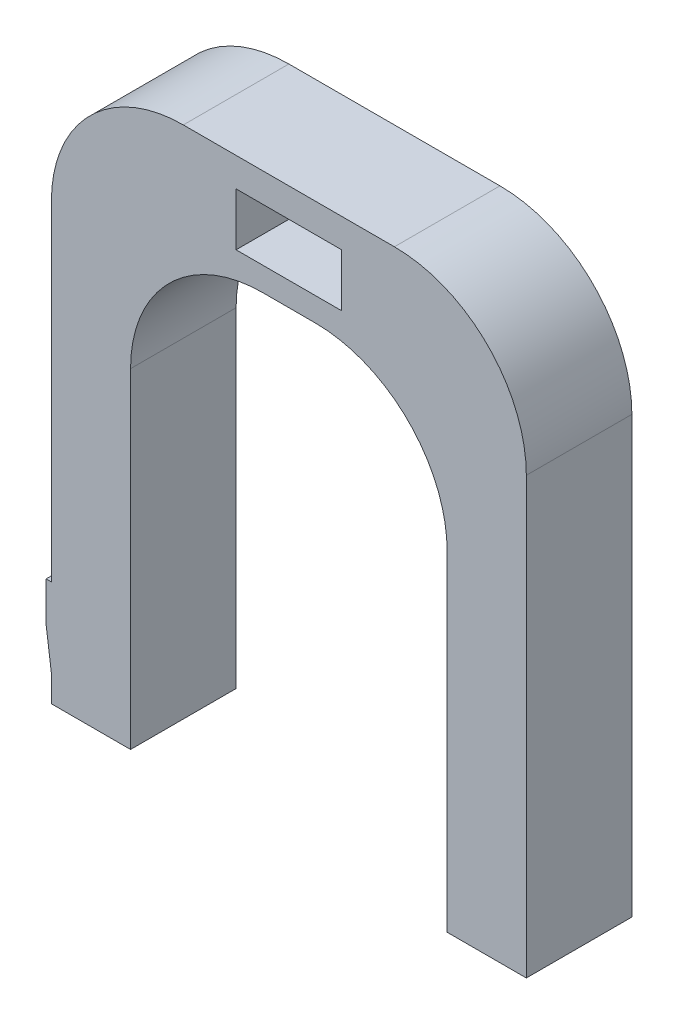
ISO-10303-21;
HEADER;
FILE_DESCRIPTION(('STEP AP214'),'2;1');
FILE_NAME('part.step','',(''),(''),'','','');
FILE_SCHEMA(('AUTOMOTIVE_DESIGN { 1 0 10303 214 1 1 1 1 }'));
ENDSEC;
DATA;
#1=APPLICATION_CONTEXT('core data for automotive mechanical design processes');
#2=APPLICATION_PROTOCOL_DEFINITION('international standard','automotive_design',2000,#1);
#3=PRODUCT_CONTEXT('',#1,'mechanical');
#4=PRODUCT('Part','Part','',(#3));
#5=PRODUCT_RELATED_PRODUCT_CATEGORY('part','',(#4));
#6=PRODUCT_DEFINITION_FORMATION('','',#4);
#7=PRODUCT_DEFINITION_CONTEXT('part definition',#1,'design');
#8=PRODUCT_DEFINITION('design','',#6,#7);
#9=PRODUCT_DEFINITION_SHAPE('','',#8);
#10=(LENGTH_UNIT() NAMED_UNIT(*) SI_UNIT(.MILLI.,.METRE.));
#11=(NAMED_UNIT(*) PLANE_ANGLE_UNIT() SI_UNIT($,.RADIAN.));
#12=(NAMED_UNIT(*) SI_UNIT($,.STERADIAN.) SOLID_ANGLE_UNIT());
#13=UNCERTAINTY_MEASURE_WITH_UNIT(LENGTH_MEASURE(1.E-05),#10,'distance_accuracy_value','');
#14=(GEOMETRIC_REPRESENTATION_CONTEXT(3) GLOBAL_UNCERTAINTY_ASSIGNED_CONTEXT((#13)) GLOBAL_UNIT_ASSIGNED_CONTEXT((#10,
#11,#12)) REPRESENTATION_CONTEXT('',''));
#15=CARTESIAN_POINT('',(0.,0.,0.));
#16=DIRECTION('',(0.,0.,1.));
#17=DIRECTION('',(1.,0.,0.));
#18=AXIS2_PLACEMENT_3D('',#15,#16,#17);
#19=CARTESIAN_POINT('',(0.,0.,4.));
#20=DIRECTION('',(1.,0.,0.));
#21=DIRECTION('',(0.,0.,-1.));
#22=AXIS2_PLACEMENT_3D('',#19,#20,#21);
#23=PLANE('',#22);
#24=DIRECTION('',(0.,0.,1.));
#25=VECTOR('',#24,1.);
#26=CARTESIAN_POINT('',(0.,1.,0.));
#27=LINE('',#26,#25);
#28=CARTESIAN_POINT('',(0.,1.,0.));
#29=VERTEX_POINT('',#28);
#30=CARTESIAN_POINT('',(0.,1.,4.));
#31=VERTEX_POINT('',#30);
#32=EDGE_CURVE('E173',#29,#31,#27,.T.);
#33=ORIENTED_EDGE('',*,*,#32,.F.);
#34=DIRECTION('',(0.,-1.,0.));
#35=VECTOR('',#34,1.);
#36=CARTESIAN_POINT('',(0.,0.,0.));
#37=LINE('',#36,#35);
#38=CARTESIAN_POINT('',(0.,0.,0.));
#39=VERTEX_POINT('',#38);
#40=EDGE_CURVE('E180',#29,#39,#37,.T.);
#41=ORIENTED_EDGE('',*,*,#40,.T.);
#42=DIRECTION('',(0.,0.,-1.));
#43=VECTOR('',#42,1.);
#44=CARTESIAN_POINT('',(0.,0.,4.));
#45=LINE('',#44,#43);
#46=CARTESIAN_POINT('',(0.,0.,4.));
#47=VERTEX_POINT('',#46);
#48=EDGE_CURVE('E282',#47,#39,#45,.T.);
#49=ORIENTED_EDGE('',*,*,#48,.F.);
#50=DIRECTION('',(0.,-1.,0.));
#51=VECTOR('',#50,1.);
#52=CARTESIAN_POINT('',(0.,0.,4.));
#53=LINE('',#52,#51);
#54=EDGE_CURVE('E192',#31,#47,#53,.T.);
#55=ORIENTED_EDGE('',*,*,#54,.F.);
#56=EDGE_LOOP('',(#33,#41,#49,#55));
#57=FACE_BOUND('',#56,.T.);
#58=ADVANCED_FACE('F33',(#57),#23,.F.);
#59=DIRECTION('',(0.,0.,-1.));
#60=VECTOR('',#59,1.);
#61=CARTESIAN_POINT('',(0.,4.,0.));
#62=LINE('',#61,#60);
#63=CARTESIAN_POINT('',(0.,4.,4.));
#64=VERTEX_POINT('',#63);
#65=CARTESIAN_POINT('',(0.,4.,0.));
#66=VERTEX_POINT('',#65);
#67=EDGE_CURVE('E56',#64,#66,#62,.T.);
#68=ORIENTED_EDGE('',*,*,#67,.F.);
#69=CARTESIAN_POINT('',(0.,16.5,4.));
#70=VERTEX_POINT('',#69);
#71=EDGE_CURVE('E259',#70,#64,#53,.T.);
#72=ORIENTED_EDGE('',*,*,#71,.F.);
#73=DIRECTION('',(0.,0.,-1.));
#74=VECTOR('',#73,1.);
#75=CARTESIAN_POINT('',(0.,16.5,4.));
#76=LINE('',#75,#74);
#77=CARTESIAN_POINT('',(0.,16.5,0.));
#78=VERTEX_POINT('',#77);
#79=EDGE_CURVE('E11',#70,#78,#76,.T.);
#80=ORIENTED_EDGE('',*,*,#79,.T.);
#81=EDGE_CURVE('E188',#78,#66,#37,.T.);
#82=ORIENTED_EDGE('',*,*,#81,.T.);
#83=EDGE_LOOP('',(#68,#72,#80,#82));
#84=FACE_BOUND('',#83,.T.);
#85=ADVANCED_FACE('F373',(#84),#23,.F.);
#86=CARTESIAN_POINT('',(0.,0.,4.));
#87=DIRECTION('',(0.,1.,0.));
#88=DIRECTION('',(0.,0.,1.));
#89=AXIS2_PLACEMENT_3D('',#86,#87,#88);
#90=PLANE('',#89);
#91=DIRECTION('',(1.,0.,0.));
#92=VECTOR('',#91,1.);
#93=CARTESIAN_POINT('',(0.,0.,0.));
#94=LINE('',#93,#92);
#95=CARTESIAN_POINT('',(3.,0.,0.));
#96=VERTEX_POINT('',#95);
#97=EDGE_CURVE('E184',#39,#96,#94,.T.);
#98=ORIENTED_EDGE('',*,*,#97,.T.);
#99=DIRECTION('',(0.,0.,1.));
#100=VECTOR('',#99,1.);
#101=CARTESIAN_POINT('',(3.,0.,0.));
#102=LINE('',#101,#100);
#103=CARTESIAN_POINT('',(3.,0.,4.));
#104=VERTEX_POINT('',#103);
#105=EDGE_CURVE('E249',#96,#104,#102,.T.);
#106=ORIENTED_EDGE('',*,*,#105,.T.);
#107=DIRECTION('',(1.,0.,0.));
#108=VECTOR('',#107,1.);
#109=CARTESIAN_POINT('',(0.,0.,4.));
#110=LINE('',#109,#108);
#111=EDGE_CURVE('E262',#47,#104,#110,.T.);
#112=ORIENTED_EDGE('',*,*,#111,.F.);
#113=ORIENTED_EDGE('',*,*,#48,.T.);
#114=EDGE_LOOP('',(#98,#106,#112,#113));
#115=FACE_BOUND('',#114,.T.);
#116=ADVANCED_FACE('F361',(#115),#90,.F.);
#117=CARTESIAN_POINT('',(15.,0.,4.));
#118=VERTEX_POINT('',#117);
#119=CARTESIAN_POINT('',(18.,0.,4.));
#120=VERTEX_POINT('',#119);
#121=EDGE_CURVE('E261',#118,#120,#110,.T.);
#122=ORIENTED_EDGE('',*,*,#121,.F.);
#123=DIRECTION('',(0.,0.,1.));
#124=VECTOR('',#123,1.);
#125=CARTESIAN_POINT('',(15.,0.,0.));
#126=LINE('',#125,#124);
#127=CARTESIAN_POINT('',(15.,0.,0.));
#128=VERTEX_POINT('',#127);
#129=EDGE_CURVE('E189',#128,#118,#126,.T.);
#130=ORIENTED_EDGE('',*,*,#129,.F.);
#131=CARTESIAN_POINT('',(18.,0.,0.));
#132=VERTEX_POINT('',#131);
#133=EDGE_CURVE('E272',#128,#132,#94,.T.);
#134=ORIENTED_EDGE('',*,*,#133,.T.);
#135=DIRECTION('',(0.,0.,-1.));
#136=VECTOR('',#135,1.);
#137=CARTESIAN_POINT('',(18.,0.,4.));
#138=LINE('',#137,#136);
#139=EDGE_CURVE('E270',#120,#132,#138,.T.);
#140=ORIENTED_EDGE('',*,*,#139,.F.);
#141=EDGE_LOOP('',(#122,#130,#134,#140));
#142=FACE_BOUND('',#141,.T.);
#143=ADVANCED_FACE('F336',(#142),#90,.F.);
#144=CARTESIAN_POINT('',(18.,0.,4.));
#145=DIRECTION('',(-1.,0.,0.));
#146=DIRECTION('',(0.,0.,1.));
#147=AXIS2_PLACEMENT_3D('',#144,#145,#146);
#148=PLANE('',#147);
#149=DIRECTION('',(0.,1.,0.));
#150=VECTOR('',#149,1.);
#151=CARTESIAN_POINT('',(18.,0.,0.));
#152=LINE('',#151,#150);
#153=CARTESIAN_POINT('',(18.,16.5,0.));
#154=VERTEX_POINT('',#153);
#155=EDGE_CURVE('E274',#132,#154,#152,.T.);
#156=ORIENTED_EDGE('',*,*,#155,.T.);
#157=DIRECTION('',(0.,0.,-1.));
#158=VECTOR('',#157,1.);
#159=CARTESIAN_POINT('',(18.,16.5,4.));
#160=LINE('',#159,#158);
#161=CARTESIAN_POINT('',(18.,16.5,4.));
#162=VERTEX_POINT('',#161);
#163=EDGE_CURVE('E311',#154,#162,#160,.F.);
#164=ORIENTED_EDGE('',*,*,#163,.T.);
#165=DIRECTION('',(0.,1.,0.));
#166=VECTOR('',#165,1.);
#167=CARTESIAN_POINT('',(18.,0.,4.));
#168=LINE('',#167,#166);
#169=EDGE_CURVE('E265',#120,#162,#168,.T.);
#170=ORIENTED_EDGE('',*,*,#169,.F.);
#171=ORIENTED_EDGE('',*,*,#139,.T.);
#172=EDGE_LOOP('',(#156,#164,#170,#171));
#173=FACE_BOUND('',#172,.T.);
#174=ADVANCED_FACE('F332',(#173),#148,.F.);
#175=CARTESIAN_POINT('',(0.,21.5,4.));
#176=DIRECTION('',(0.,-1.,0.));
#177=DIRECTION('',(0.,0.,-1.));
#178=AXIS2_PLACEMENT_3D('',#175,#176,#177);
#179=PLANE('',#178);
#180=DIRECTION('',(-1.,0.,0.));
#181=VECTOR('',#180,1.);
#182=CARTESIAN_POINT('',(0.,21.5,4.));
#183=LINE('',#182,#181);
#184=CARTESIAN_POINT('',(13.,21.5,4.));
#185=VERTEX_POINT('',#184);
#186=CARTESIAN_POINT('',(5.,21.5,4.));
#187=VERTEX_POINT('',#186);
#188=EDGE_CURVE('E268',#185,#187,#183,.T.);
#189=ORIENTED_EDGE('',*,*,#188,.F.);
#190=DIRECTION('',(0.,0.,-1.));
#191=VECTOR('',#190,1.);
#192=CARTESIAN_POINT('',(13.,21.5,4.));
#193=LINE('',#192,#191);
#194=CARTESIAN_POINT('',(13.,21.5,0.));
#195=VERTEX_POINT('',#194);
#196=EDGE_CURVE('E304',#185,#195,#193,.T.);
#197=ORIENTED_EDGE('',*,*,#196,.T.);
#198=DIRECTION('',(-1.,0.,0.));
#199=VECTOR('',#198,1.);
#200=CARTESIAN_POINT('',(0.,21.5,0.));
#201=LINE('',#200,#199);
#202=CARTESIAN_POINT('',(5.,21.5,0.));
#203=VERTEX_POINT('',#202);
#204=EDGE_CURVE('E277',#195,#203,#201,.T.);
#205=ORIENTED_EDGE('',*,*,#204,.T.);
#206=DIRECTION('',(0.,0.,-1.));
#207=VECTOR('',#206,1.);
#208=CARTESIAN_POINT('',(5.,21.5,4.));
#209=LINE('',#208,#207);
#210=EDGE_CURVE('E302',#203,#187,#209,.F.);
#211=ORIENTED_EDGE('',*,*,#210,.T.);
#212=EDGE_LOOP('',(#189,#197,#205,#211));
#213=FACE_BOUND('',#212,.T.);
#214=ADVANCED_FACE('F325',(#213),#179,.F.);
#215=CARTESIAN_POINT('',(0.,0.,4.));
#216=DIRECTION('',(0.,0.,-1.));
#217=DIRECTION('',(-1.,0.,0.));
#218=AXIS2_PLACEMENT_3D('',#215,#216,#217);
#219=PLANE('',#218);
#220=DIRECTION('',(1.,0.,0.));
#221=VECTOR('',#220,1.);
#222=CARTESIAN_POINT('',(7.,18.4009479824988,4.));
#223=LINE('',#222,#221);
#224=CARTESIAN_POINT('',(7.,18.4009479824988,4.));
#225=VERTEX_POINT('',#224);
#226=CARTESIAN_POINT('',(11.,18.4009479824988,4.));
#227=VERTEX_POINT('',#226);
#228=EDGE_CURVE('E223',#225,#227,#223,.T.);
#229=ORIENTED_EDGE('',*,*,#228,.F.);
#230=DIRECTION('',(0.,-1.,0.));
#231=VECTOR('',#230,1.);
#232=CARTESIAN_POINT('',(7.,20.4009479824988,4.));
#233=LINE('',#232,#231);
#234=CARTESIAN_POINT('',(7.,20.4009479824988,4.));
#235=VERTEX_POINT('',#234);
#236=EDGE_CURVE('E207',#235,#225,#233,.T.);
#237=ORIENTED_EDGE('',*,*,#236,.F.);
#238=DIRECTION('',(-1.,0.,0.));
#239=VECTOR('',#238,1.);
#240=CARTESIAN_POINT('',(7.,20.4009479824988,4.));
#241=LINE('',#240,#239);
#242=CARTESIAN_POINT('',(11.,20.4009479824988,4.));
#243=VERTEX_POINT('',#242);
#244=EDGE_CURVE('E212',#243,#235,#241,.T.);
#245=ORIENTED_EDGE('',*,*,#244,.F.);
#246=DIRECTION('',(0.,1.,0.));
#247=VECTOR('',#246,1.);
#248=CARTESIAN_POINT('',(11.,20.4009479824988,4.));
#249=LINE('',#248,#247);
#250=EDGE_CURVE('E226',#227,#243,#249,.T.);
#251=ORIENTED_EDGE('',*,*,#250,.F.);
#252=EDGE_LOOP('',(#229,#237,#245,#251));
#253=FACE_BOUND('',#252,.T.);
#254=DIRECTION('',(0.,1.,0.));
#255=VECTOR('',#254,1.);
#256=CARTESIAN_POINT('',(-0.2,1.,4.));
#257=LINE('',#256,#255);
#258=CARTESIAN_POINT('',(-0.2,2.5,4.));
#259=VERTEX_POINT('',#258);
#260=CARTESIAN_POINT('',(-0.2,4.,4.));
#261=VERTEX_POINT('',#260);
#262=EDGE_CURVE('E363',#259,#261,#257,.T.);
#263=ORIENTED_EDGE('',*,*,#262,.F.);
#264=DIRECTION('',(-0.132163720091018,0.991227900682635,0.));
#265=VECTOR('',#264,1.);
#266=CARTESIAN_POINT('',(0.,1.,4.));
#267=LINE('',#266,#265);
#268=EDGE_CURVE('E48',#31,#259,#267,.T.);
#269=ORIENTED_EDGE('',*,*,#268,.F.);
#270=ORIENTED_EDGE('',*,*,#54,.T.);
#271=ORIENTED_EDGE('',*,*,#111,.T.);
#272=DIRECTION('',(0.,-1.,0.));
#273=VECTOR('',#272,1.);
#274=CARTESIAN_POINT('',(3.,0.,4.));
#275=LINE('',#274,#273);
#276=CARTESIAN_POINT('',(3.,12.5,4.));
#277=VERTEX_POINT('',#276);
#278=EDGE_CURVE('E233',#277,#104,#275,.T.);
#279=ORIENTED_EDGE('',*,*,#278,.F.);
#280=CARTESIAN_POINT('',(8.,12.5,4.));
#281=DIRECTION('',(0.,0.,-1.));
#282=DIRECTION('',(-1.,0.,0.));
#283=AXIS2_PLACEMENT_3D('',#280,#281,#282);
#284=CIRCLE('',#283,5.);
#285=CARTESIAN_POINT('',(8.,17.5,4.));
#286=VERTEX_POINT('',#285);
#287=EDGE_CURVE('E298',#277,#286,#284,.T.);
#288=ORIENTED_EDGE('',*,*,#287,.T.);
#289=DIRECTION('',(-1.,0.,0.));
#290=VECTOR('',#289,1.);
#291=CARTESIAN_POINT('',(3.,17.5,4.));
#292=LINE('',#291,#290);
#293=CARTESIAN_POINT('',(10.,17.5,4.));
#294=VERTEX_POINT('',#293);
#295=EDGE_CURVE('E243',#294,#286,#292,.T.);
#296=ORIENTED_EDGE('',*,*,#295,.F.);
#297=CARTESIAN_POINT('',(10.,12.5,4.));
#298=DIRECTION('',(0.,0.,-1.));
#299=DIRECTION('',(-1.,0.,0.));
#300=AXIS2_PLACEMENT_3D('',#297,#298,#299);
#301=CIRCLE('',#300,5.);
#302=CARTESIAN_POINT('',(15.,12.5,4.));
#303=VERTEX_POINT('',#302);
#304=EDGE_CURVE('E294',#294,#303,#301,.T.);
#305=ORIENTED_EDGE('',*,*,#304,.T.);
#306=DIRECTION('',(0.,1.,0.));
#307=VECTOR('',#306,1.);
#308=CARTESIAN_POINT('',(15.,0.,4.));
#309=LINE('',#308,#307);
#310=EDGE_CURVE('E251',#118,#303,#309,.T.);
#311=ORIENTED_EDGE('',*,*,#310,.F.);
#312=ORIENTED_EDGE('',*,*,#121,.T.);
#313=ORIENTED_EDGE('',*,*,#169,.T.);
#314=CARTESIAN_POINT('',(13.,16.5,4.));
#315=DIRECTION('',(0.,0.,-1.));
#316=DIRECTION('',(-1.,0.,0.));
#317=AXIS2_PLACEMENT_3D('',#314,#315,#316);
#318=CIRCLE('',#317,5.);
#319=EDGE_CURVE('E41',#162,#185,#318,.F.);
#320=ORIENTED_EDGE('',*,*,#319,.T.);
#321=ORIENTED_EDGE('',*,*,#188,.T.);
#322=CARTESIAN_POINT('',(5.,16.5,4.));
#323=DIRECTION('',(0.,0.,-1.));
#324=DIRECTION('',(-1.,0.,0.));
#325=AXIS2_PLACEMENT_3D('',#322,#323,#324);
#326=CIRCLE('',#325,5.);
#327=EDGE_CURVE('E313',#187,#70,#326,.F.);
#328=ORIENTED_EDGE('',*,*,#327,.T.);
#329=ORIENTED_EDGE('',*,*,#71,.T.);
#330=DIRECTION('',(1.,0.,0.));
#331=VECTOR('',#330,1.);
#332=CARTESIAN_POINT('',(-0.2,4.,4.));
#333=LINE('',#332,#331);
#334=EDGE_CURVE('E204',#261,#64,#333,.T.);
#335=ORIENTED_EDGE('',*,*,#334,.F.);
#336=EDGE_LOOP('',(#263,#269,#270,#271,#279,#288,#296,#305,#311,#312,#313,#320,#321,#328,#329,#335));
#337=FACE_BOUND('',#336,.T.);
#338=ADVANCED_FACE('F318',(#253,#337),#219,.F.);
#339=CARTESIAN_POINT('',(0.,0.,0.));
#340=DIRECTION('',(0.,0.,-1.));
#341=DIRECTION('',(-1.,0.,0.));
#342=AXIS2_PLACEMENT_3D('',#339,#340,#341);
#343=PLANE('',#342);
#344=DIRECTION('',(-0.132163720091018,0.991227900682635,0.));
#345=VECTOR('',#344,1.);
#346=CARTESIAN_POINT('',(0.,1.,0.));
#347=LINE('',#346,#345);
#348=CARTESIAN_POINT('',(-0.2,2.5,0.));
#349=VERTEX_POINT('',#348);
#350=EDGE_CURVE('E169',#29,#349,#347,.T.);
#351=ORIENTED_EDGE('',*,*,#350,.T.);
#352=DIRECTION('',(0.,-1.,0.));
#353=VECTOR('',#352,1.);
#354=CARTESIAN_POINT('',(-0.2,1.,0.));
#355=LINE('',#354,#353);
#356=CARTESIAN_POINT('',(-0.2,4.,0.));
#357=VERTEX_POINT('',#356);
#358=EDGE_CURVE('E194',#357,#349,#355,.T.);
#359=ORIENTED_EDGE('',*,*,#358,.F.);
#360=DIRECTION('',(1.,0.,0.));
#361=VECTOR('',#360,1.);
#362=CARTESIAN_POINT('',(-0.2,4.,0.));
#363=LINE('',#362,#361);
#364=EDGE_CURVE('E201',#357,#66,#363,.T.);
#365=ORIENTED_EDGE('',*,*,#364,.T.);
#366=ORIENTED_EDGE('',*,*,#81,.F.);
#367=CARTESIAN_POINT('',(5.,16.5,0.));
#368=DIRECTION('',(0.,0.,-1.));
#369=DIRECTION('',(-1.,0.,0.));
#370=AXIS2_PLACEMENT_3D('',#367,#368,#369);
#371=CIRCLE('',#370,5.);
#372=EDGE_CURVE('E307',#78,#203,#371,.T.);
#373=ORIENTED_EDGE('',*,*,#372,.T.);
#374=ORIENTED_EDGE('',*,*,#204,.F.);
#375=CARTESIAN_POINT('',(13.,16.5,0.));
#376=DIRECTION('',(0.,0.,-1.));
#377=DIRECTION('',(-1.,0.,0.));
#378=AXIS2_PLACEMENT_3D('',#375,#376,#377);
#379=CIRCLE('',#378,5.);
#380=EDGE_CURVE('E309',#195,#154,#379,.T.);
#381=ORIENTED_EDGE('',*,*,#380,.T.);
#382=ORIENTED_EDGE('',*,*,#155,.F.);
#383=ORIENTED_EDGE('',*,*,#133,.F.);
#384=DIRECTION('',(0.,1.,0.));
#385=VECTOR('',#384,1.);
#386=CARTESIAN_POINT('',(15.,0.,0.));
#387=LINE('',#386,#385);
#388=CARTESIAN_POINT('',(15.,12.5,0.));
#389=VERTEX_POINT('',#388);
#390=EDGE_CURVE('E242',#128,#389,#387,.T.);
#391=ORIENTED_EDGE('',*,*,#390,.T.);
#392=CARTESIAN_POINT('',(10.,12.5,0.));
#393=DIRECTION('',(0.,0.,-1.));
#394=DIRECTION('',(-1.,0.,0.));
#395=AXIS2_PLACEMENT_3D('',#392,#393,#394);
#396=CIRCLE('',#395,5.);
#397=CARTESIAN_POINT('',(10.,17.5,0.));
#398=VERTEX_POINT('',#397);
#399=EDGE_CURVE('E296',#389,#398,#396,.F.);
#400=ORIENTED_EDGE('',*,*,#399,.T.);
#401=DIRECTION('',(-1.,0.,0.));
#402=VECTOR('',#401,1.);
#403=CARTESIAN_POINT('',(3.,17.5,0.));
#404=LINE('',#403,#402);
#405=CARTESIAN_POINT('',(8.,17.5,0.));
#406=VERTEX_POINT('',#405);
#407=EDGE_CURVE('E246',#398,#406,#404,.T.);
#408=ORIENTED_EDGE('',*,*,#407,.T.);
#409=CARTESIAN_POINT('',(8.,12.5,0.));
#410=DIRECTION('',(0.,0.,-1.));
#411=DIRECTION('',(-1.,0.,0.));
#412=AXIS2_PLACEMENT_3D('',#409,#410,#411);
#413=CIRCLE('',#412,5.);
#414=CARTESIAN_POINT('',(3.,12.5,0.));
#415=VERTEX_POINT('',#414);
#416=EDGE_CURVE('E300',#406,#415,#413,.F.);
#417=ORIENTED_EDGE('',*,*,#416,.T.);
#418=DIRECTION('',(0.,-1.,0.));
#419=VECTOR('',#418,1.);
#420=CARTESIAN_POINT('',(3.,0.,0.));
#421=LINE('',#420,#419);
#422=EDGE_CURVE('E240',#415,#96,#421,.T.);
#423=ORIENTED_EDGE('',*,*,#422,.T.);
#424=ORIENTED_EDGE('',*,*,#97,.F.);
#425=ORIENTED_EDGE('',*,*,#40,.F.);
#426=EDGE_LOOP('',(#351,#359,#365,#366,#373,#374,#381,#382,#383,#391,#400,#408,#417,#423,#424,#425));
#427=FACE_BOUND('',#426,.T.);
#428=DIRECTION('',(0.,-1.,0.));
#429=VECTOR('',#428,1.);
#430=CARTESIAN_POINT('',(7.,20.4009479824988,0.));
#431=LINE('',#430,#429);
#432=CARTESIAN_POINT('',(7.,20.4009479824988,0.));
#433=VERTEX_POINT('',#432);
#434=CARTESIAN_POINT('',(7.,18.4009479824988,0.));
#435=VERTEX_POINT('',#434);
#436=EDGE_CURVE('E208',#433,#435,#431,.T.);
#437=ORIENTED_EDGE('',*,*,#436,.T.);
#438=DIRECTION('',(1.,0.,0.));
#439=VECTOR('',#438,1.);
#440=CARTESIAN_POINT('',(7.,18.4009479824988,0.));
#441=LINE('',#440,#439);
#442=CARTESIAN_POINT('',(11.,18.4009479824988,0.));
#443=VERTEX_POINT('',#442);
#444=EDGE_CURVE('E211',#435,#443,#441,.T.);
#445=ORIENTED_EDGE('',*,*,#444,.T.);
#446=DIRECTION('',(0.,1.,0.));
#447=VECTOR('',#446,1.);
#448=CARTESIAN_POINT('',(11.,20.4009479824988,0.));
#449=LINE('',#448,#447);
#450=CARTESIAN_POINT('',(11.,20.4009479824988,0.));
#451=VERTEX_POINT('',#450);
#452=EDGE_CURVE('E215',#443,#451,#449,.T.);
#453=ORIENTED_EDGE('',*,*,#452,.T.);
#454=DIRECTION('',(-1.,0.,0.));
#455=VECTOR('',#454,1.);
#456=CARTESIAN_POINT('',(7.,20.4009479824988,0.));
#457=LINE('',#456,#455);
#458=EDGE_CURVE('E218',#451,#433,#457,.T.);
#459=ORIENTED_EDGE('',*,*,#458,.T.);
#460=EDGE_LOOP('',(#437,#445,#453,#459));
#461=FACE_BOUND('',#460,.T.);
#462=ADVANCED_FACE('F181',(#427,#461),#343,.T.);
#463=CARTESIAN_POINT('',(3.,0.,0.));
#464=DIRECTION('',(-1.,0.,0.));
#465=DIRECTION('',(0.,0.,1.));
#466=AXIS2_PLACEMENT_3D('',#463,#464,#465);
#467=PLANE('',#466);
#468=ORIENTED_EDGE('',*,*,#422,.F.);
#469=DIRECTION('',(0.,0.,1.));
#470=VECTOR('',#469,1.);
#471=CARTESIAN_POINT('',(3.,12.5,4.));
#472=LINE('',#471,#470);
#473=EDGE_CURVE('E291',#415,#277,#472,.T.);
#474=ORIENTED_EDGE('',*,*,#473,.T.);
#475=ORIENTED_EDGE('',*,*,#278,.T.);
#476=ORIENTED_EDGE('',*,*,#105,.F.);
#477=EDGE_LOOP('',(#468,#474,#475,#476));
#478=FACE_BOUND('',#477,.T.);
#479=ADVANCED_FACE('F357',(#478),#467,.F.);
#480=CARTESIAN_POINT('',(3.,17.5,0.));
#481=DIRECTION('',(0.,1.,0.));
#482=DIRECTION('',(0.,0.,1.));
#483=AXIS2_PLACEMENT_3D('',#480,#481,#482);
#484=PLANE('',#483);
#485=ORIENTED_EDGE('',*,*,#407,.F.);
#486=DIRECTION('',(0.,0.,1.));
#487=VECTOR('',#486,1.);
#488=CARTESIAN_POINT('',(10.,17.5,4.));
#489=LINE('',#488,#487);
#490=EDGE_CURVE('E286',#398,#294,#489,.T.);
#491=ORIENTED_EDGE('',*,*,#490,.T.);
#492=ORIENTED_EDGE('',*,*,#295,.T.);
#493=DIRECTION('',(0.,0.,1.));
#494=VECTOR('',#493,1.);
#495=CARTESIAN_POINT('',(8.,17.5,0.));
#496=LINE('',#495,#494);
#497=EDGE_CURVE('E284',#286,#406,#496,.F.);
#498=ORIENTED_EDGE('',*,*,#497,.T.);
#499=EDGE_LOOP('',(#485,#491,#492,#498));
#500=FACE_BOUND('',#499,.T.);
#501=ADVANCED_FACE('F347',(#500),#484,.F.);
#502=CARTESIAN_POINT('',(15.,0.,0.));
#503=DIRECTION('',(1.,0.,0.));
#504=DIRECTION('',(0.,0.,-1.));
#505=AXIS2_PLACEMENT_3D('',#502,#503,#504);
#506=PLANE('',#505);
#507=ORIENTED_EDGE('',*,*,#310,.T.);
#508=DIRECTION('',(0.,0.,1.));
#509=VECTOR('',#508,1.);
#510=CARTESIAN_POINT('',(15.,12.5,0.));
#511=LINE('',#510,#509);
#512=EDGE_CURVE('E289',#303,#389,#511,.F.);
#513=ORIENTED_EDGE('',*,*,#512,.T.);
#514=ORIENTED_EDGE('',*,*,#390,.F.);
#515=ORIENTED_EDGE('',*,*,#129,.T.);
#516=EDGE_LOOP('',(#507,#513,#514,#515));
#517=FACE_BOUND('',#516,.T.);
#518=ADVANCED_FACE('F395',(#517),#506,.F.);
#519=CARTESIAN_POINT('',(10.,12.5,0.));
#520=DIRECTION('',(0.,0.,-1.));
#521=DIRECTION('',(-1.,0.,0.));
#522=AXIS2_PLACEMENT_3D('',#519,#520,#521);
#523=CYLINDRICAL_SURFACE('',#522,5.);
#524=ORIENTED_EDGE('',*,*,#399,.F.);
#525=ORIENTED_EDGE('',*,*,#512,.F.);
#526=ORIENTED_EDGE('',*,*,#304,.F.);
#527=ORIENTED_EDGE('',*,*,#490,.F.);
#528=EDGE_LOOP('',(#524,#525,#526,#527));
#529=FACE_BOUND('',#528,.T.);
#530=ADVANCED_FACE('F344',(#529),#523,.F.);
#531=CARTESIAN_POINT('',(8.,12.5,0.));
#532=DIRECTION('',(0.,0.,-1.));
#533=DIRECTION('',(-1.,0.,0.));
#534=AXIS2_PLACEMENT_3D('',#531,#532,#533);
#535=CYLINDRICAL_SURFACE('',#534,5.);
#536=ORIENTED_EDGE('',*,*,#416,.F.);
#537=ORIENTED_EDGE('',*,*,#497,.F.);
#538=ORIENTED_EDGE('',*,*,#287,.F.);
#539=ORIENTED_EDGE('',*,*,#473,.F.);
#540=EDGE_LOOP('',(#536,#537,#538,#539));
#541=FACE_BOUND('',#540,.T.);
#542=ADVANCED_FACE('F354',(#541),#535,.F.);
#543=CARTESIAN_POINT('',(13.,16.5,4.));
#544=DIRECTION('',(0.,0.,-1.));
#545=DIRECTION('',(-1.,0.,0.));
#546=AXIS2_PLACEMENT_3D('',#543,#544,#545);
#547=CYLINDRICAL_SURFACE('',#546,5.);
#548=ORIENTED_EDGE('',*,*,#319,.F.);
#549=ORIENTED_EDGE('',*,*,#163,.F.);
#550=ORIENTED_EDGE('',*,*,#380,.F.);
#551=ORIENTED_EDGE('',*,*,#196,.F.);
#552=EDGE_LOOP('',(#548,#549,#550,#551));
#553=FACE_BOUND('',#552,.T.);
#554=ADVANCED_FACE('F328',(#553),#547,.T.);
#555=CARTESIAN_POINT('',(5.,16.5,4.));
#556=DIRECTION('',(0.,0.,-1.));
#557=DIRECTION('',(-1.,0.,0.));
#558=AXIS2_PLACEMENT_3D('',#555,#556,#557);
#559=CYLINDRICAL_SURFACE('',#558,5.);
#560=ORIENTED_EDGE('',*,*,#327,.F.);
#561=ORIENTED_EDGE('',*,*,#210,.F.);
#562=ORIENTED_EDGE('',*,*,#372,.F.);
#563=ORIENTED_EDGE('',*,*,#79,.F.);
#564=EDGE_LOOP('',(#560,#561,#562,#563));
#565=FACE_BOUND('',#564,.T.);
#566=ADVANCED_FACE('F35',(#565),#559,.T.);
#567=CARTESIAN_POINT('',(7.,20.4009479824988,0.));
#568=DIRECTION('',(-1.,0.,0.));
#569=DIRECTION('',(0.,0.,1.));
#570=AXIS2_PLACEMENT_3D('',#567,#568,#569);
#571=PLANE('',#570);
#572=ORIENTED_EDGE('',*,*,#236,.T.);
#573=DIRECTION('',(0.,0.,1.));
#574=VECTOR('',#573,1.);
#575=CARTESIAN_POINT('',(7.,18.4009479824988,0.));
#576=LINE('',#575,#574);
#577=EDGE_CURVE('E221',#435,#225,#576,.T.);
#578=ORIENTED_EDGE('',*,*,#577,.F.);
#579=ORIENTED_EDGE('',*,*,#436,.F.);
#580=DIRECTION('',(0.,0.,1.));
#581=VECTOR('',#580,1.);
#582=CARTESIAN_POINT('',(7.,20.4009479824988,0.));
#583=LINE('',#582,#581);
#584=EDGE_CURVE('E231',#433,#235,#583,.T.);
#585=ORIENTED_EDGE('',*,*,#584,.T.);
#586=EDGE_LOOP('',(#572,#578,#579,#585));
#587=FACE_BOUND('',#586,.T.);
#588=ADVANCED_FACE('F377',(#587),#571,.F.);
#589=CARTESIAN_POINT('',(7.,20.4009479824988,0.));
#590=DIRECTION('',(0.,1.,0.));
#591=DIRECTION('',(0.,0.,1.));
#592=AXIS2_PLACEMENT_3D('',#589,#590,#591);
#593=PLANE('',#592);
#594=ORIENTED_EDGE('',*,*,#244,.T.);
#595=ORIENTED_EDGE('',*,*,#584,.F.);
#596=ORIENTED_EDGE('',*,*,#458,.F.);
#597=DIRECTION('',(0.,0.,1.));
#598=VECTOR('',#597,1.);
#599=CARTESIAN_POINT('',(11.,20.4009479824988,0.));
#600=LINE('',#599,#598);
#601=EDGE_CURVE('E234',#451,#243,#600,.T.);
#602=ORIENTED_EDGE('',*,*,#601,.T.);
#603=EDGE_LOOP('',(#594,#595,#596,#602));
#604=FACE_BOUND('',#603,.T.);
#605=ADVANCED_FACE('F382',(#604),#593,.F.);
#606=CARTESIAN_POINT('',(11.,20.4009479824988,0.));
#607=DIRECTION('',(1.,0.,0.));
#608=DIRECTION('',(0.,0.,-1.));
#609=AXIS2_PLACEMENT_3D('',#606,#607,#608);
#610=PLANE('',#609);
#611=ORIENTED_EDGE('',*,*,#250,.T.);
#612=ORIENTED_EDGE('',*,*,#601,.F.);
#613=ORIENTED_EDGE('',*,*,#452,.F.);
#614=DIRECTION('',(0.,0.,1.));
#615=VECTOR('',#614,1.);
#616=CARTESIAN_POINT('',(11.,18.4009479824988,0.));
#617=LINE('',#616,#615);
#618=EDGE_CURVE('E236',#443,#227,#617,.T.);
#619=ORIENTED_EDGE('',*,*,#618,.T.);
#620=EDGE_LOOP('',(#611,#612,#613,#619));
#621=FACE_BOUND('',#620,.T.);
#622=ADVANCED_FACE('F430',(#621),#610,.F.);
#623=CARTESIAN_POINT('',(7.,18.4009479824988,0.));
#624=DIRECTION('',(0.,-1.,0.));
#625=DIRECTION('',(0.,0.,-1.));
#626=AXIS2_PLACEMENT_3D('',#623,#624,#625);
#627=PLANE('',#626);
#628=ORIENTED_EDGE('',*,*,#228,.T.);
#629=ORIENTED_EDGE('',*,*,#618,.F.);
#630=ORIENTED_EDGE('',*,*,#444,.F.);
#631=ORIENTED_EDGE('',*,*,#577,.T.);
#632=EDGE_LOOP('',(#628,#629,#630,#631));
#633=FACE_BOUND('',#632,.T.);
#634=ADVANCED_FACE('F440',(#633),#627,.F.);
#635=CARTESIAN_POINT('',(-0.2,4.,0.));
#636=DIRECTION('',(0.,-1.,0.));
#637=DIRECTION('',(0.,0.,-1.));
#638=AXIS2_PLACEMENT_3D('',#635,#636,#637);
#639=PLANE('',#638);
#640=ORIENTED_EDGE('',*,*,#67,.T.);
#641=ORIENTED_EDGE('',*,*,#364,.F.);
#642=DIRECTION('',(0.,0.,-1.));
#643=VECTOR('',#642,1.);
#644=CARTESIAN_POINT('',(-0.2,4.,0.));
#645=LINE('',#644,#643);
#646=EDGE_CURVE('E198',#261,#357,#645,.T.);
#647=ORIENTED_EDGE('',*,*,#646,.F.);
#648=ORIENTED_EDGE('',*,*,#334,.T.);
#649=EDGE_LOOP('',(#640,#641,#647,#648));
#650=FACE_BOUND('',#649,.T.);
#651=ADVANCED_FACE('F371',(#650),#639,.F.);
#652=CARTESIAN_POINT('',(-0.2,0.,0.));
#653=DIRECTION('',(1.,0.,0.));
#654=DIRECTION('',(0.,0.,-1.));
#655=AXIS2_PLACEMENT_3D('',#652,#653,#654);
#656=PLANE('',#655);
#657=ORIENTED_EDGE('',*,*,#358,.T.);
#658=DIRECTION('',(0.,0.,1.));
#659=VECTOR('',#658,1.);
#660=CARTESIAN_POINT('',(-0.2,2.5,0.));
#661=LINE('',#660,#659);
#662=EDGE_CURVE('E174',#349,#259,#661,.T.);
#663=ORIENTED_EDGE('',*,*,#662,.T.);
#664=ORIENTED_EDGE('',*,*,#262,.T.);
#665=ORIENTED_EDGE('',*,*,#646,.T.);
#666=EDGE_LOOP('',(#657,#663,#664,#665));
#667=FACE_BOUND('',#666,.T.);
#668=ADVANCED_FACE('F369',(#667),#656,.F.);
#669=CARTESIAN_POINT('',(0.,1.,0.));
#670=DIRECTION('',(0.991227900682635,0.132163720091018,0.));
#671=DIRECTION('',(-0.132163720091018,0.991227900682635,0.));
#672=AXIS2_PLACEMENT_3D('',#669,#670,#671);
#673=PLANE('',#672);
#674=ORIENTED_EDGE('',*,*,#268,.T.);
#675=ORIENTED_EDGE('',*,*,#662,.F.);
#676=ORIENTED_EDGE('',*,*,#350,.F.);
#677=ORIENTED_EDGE('',*,*,#32,.T.);
#678=EDGE_LOOP('',(#674,#675,#676,#677));
#679=FACE_BOUND('',#678,.T.);
#680=ADVANCED_FACE('F171',(#679),#673,.F.);
#681=CLOSED_SHELL('',(#58,#85,#116,#143,#174,#214,#338,#462,#479,#501,#518,#530,#542,#554,#566,
#588,#605,#622,#634,#651,#668,#680));
#682=MANIFOLD_SOLID_BREP('B2',#681);
#683=ADVANCED_BREP_SHAPE_REPRESENTATION('',(#18,#682),#14);
#684=SHAPE_DEFINITION_REPRESENTATION(#9,#683);
ENDSEC;
END-ISO-10303-21;
